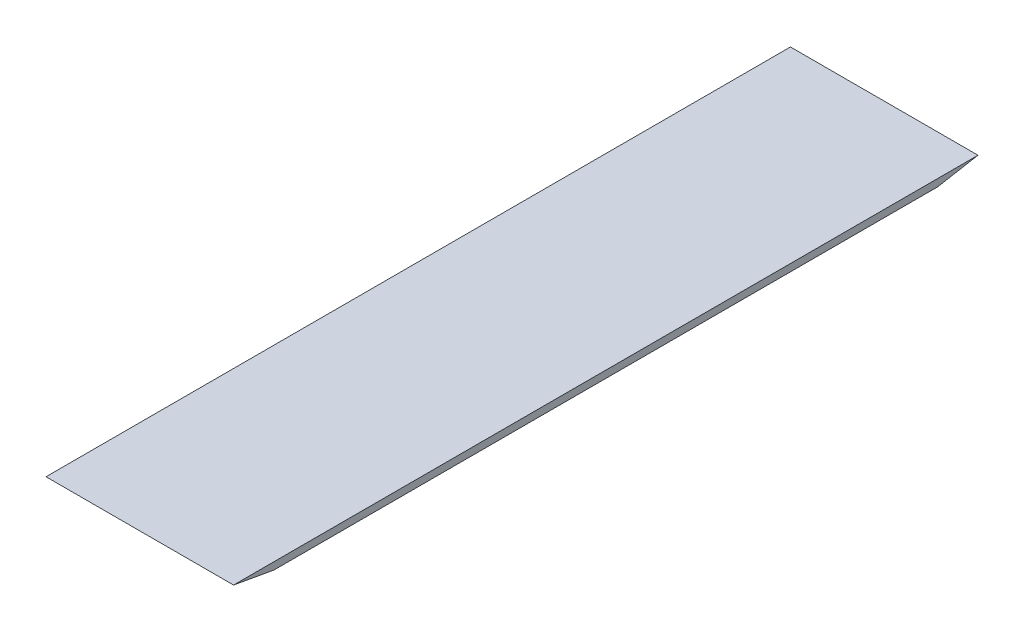
ISO-10303-21;
HEADER;
FILE_DESCRIPTION(('STEP AP214'),'2;1');
FILE_NAME('part.step','',(''),(''),'','','');
FILE_SCHEMA(('AUTOMOTIVE_DESIGN { 1 0 10303 214 1 1 1 1 }'));
ENDSEC;
DATA;
#1=APPLICATION_CONTEXT('core data for automotive mechanical design processes');
#2=APPLICATION_PROTOCOL_DEFINITION('international standard','automotive_design',2000,#1);
#3=PRODUCT_CONTEXT('',#1,'mechanical');
#4=PRODUCT('Part','Part','',(#3));
#5=PRODUCT_RELATED_PRODUCT_CATEGORY('part','',(#4));
#6=PRODUCT_DEFINITION_FORMATION('','',#4);
#7=PRODUCT_DEFINITION_CONTEXT('part definition',#1,'design');
#8=PRODUCT_DEFINITION('design','',#6,#7);
#9=PRODUCT_DEFINITION_SHAPE('','',#8);
#10=(LENGTH_UNIT() NAMED_UNIT(*) SI_UNIT(.MILLI.,.METRE.));
#11=(NAMED_UNIT(*) PLANE_ANGLE_UNIT() SI_UNIT($,.RADIAN.));
#12=(NAMED_UNIT(*) SI_UNIT($,.STERADIAN.) SOLID_ANGLE_UNIT());
#13=UNCERTAINTY_MEASURE_WITH_UNIT(LENGTH_MEASURE(1.E-05),#10,'distance_accuracy_value','');
#14=(GEOMETRIC_REPRESENTATION_CONTEXT(3) GLOBAL_UNCERTAINTY_ASSIGNED_CONTEXT((#13)) GLOBAL_UNIT_ASSIGNED_CONTEXT((#10,
#11,#12)) REPRESENTATION_CONTEXT('',''));
#15=CARTESIAN_POINT('',(0.,0.,0.));
#16=DIRECTION('',(0.,0.,1.));
#17=DIRECTION('',(1.,0.,0.));
#18=AXIS2_PLACEMENT_3D('',#15,#16,#17);
#19=CARTESIAN_POINT('',(130.,0.,0.));
#20=DIRECTION('',(0.,0.984427575508482,-0.175790638483658));
#21=DIRECTION('',(0.,0.175790638483658,0.984427575508482));
#22=AXIS2_PLACEMENT_3D('',#19,#20,#21);
#23=PLANE('',#22);
#24=DIRECTION('',(0.,-0.175790638483658,-0.984427575508482));
#25=VECTOR('',#24,1.);
#26=CARTESIAN_POINT('',(0.,0.,0.));
#27=LINE('',#26,#25);
#28=CARTESIAN_POINT('',(0.,0.,0.));
#29=VERTEX_POINT('',#28);
#30=CARTESIAN_POINT('',(0.,-5.,-28.));
#31=VERTEX_POINT('',#30);
#32=EDGE_CURVE('E107',#29,#31,#27,.T.);
#33=ORIENTED_EDGE('',*,*,#32,.T.);
#34=DIRECTION('',(-1.,0.,0.));
#35=VECTOR('',#34,1.);
#36=CARTESIAN_POINT('',(130.,-5.,-28.));
#37=LINE('',#36,#35);
#38=CARTESIAN_POINT('',(130.,-5.,-28.));
#39=VERTEX_POINT('',#38);
#40=EDGE_CURVE('E11',#39,#31,#37,.T.);
#41=ORIENTED_EDGE('',*,*,#40,.F.);
#42=DIRECTION('',(0.,-0.175790638483658,-0.984427575508482));
#43=VECTOR('',#42,1.);
#44=CARTESIAN_POINT('',(130.,0.,0.));
#45=LINE('',#44,#43);
#46=CARTESIAN_POINT('',(130.,0.,0.));
#47=VERTEX_POINT('',#46);
#48=EDGE_CURVE('E89',#47,#39,#45,.T.);
#49=ORIENTED_EDGE('',*,*,#48,.F.);
#50=DIRECTION('',(-1.,0.,0.));
#51=VECTOR('',#50,1.);
#52=CARTESIAN_POINT('',(130.,0.,0.));
#53=LINE('',#52,#51);
#54=EDGE_CURVE('E56',#47,#29,#53,.T.);
#55=ORIENTED_EDGE('',*,*,#54,.T.);
#56=EDGE_LOOP('',(#33,#41,#49,#55));
#57=FACE_BOUND('',#56,.T.);
#58=ADVANCED_FACE('F39',(#57),#23,.F.);
#59=CARTESIAN_POINT('',(130.,-5.,-28.));
#60=DIRECTION('',(0.,1.,0.));
#61=DIRECTION('',(0.,0.,1.));
#62=AXIS2_PLACEMENT_3D('',#59,#60,#61);
#63=PLANE('',#62);
#64=DIRECTION('',(0.,0.,-1.));
#65=VECTOR('',#64,1.);
#66=CARTESIAN_POINT('',(0.,-5.,-28.));
#67=LINE('',#66,#65);
#68=CARTESIAN_POINT('',(0.,-5.,-488.));
#69=VERTEX_POINT('',#68);
#70=EDGE_CURVE('E95',#31,#69,#67,.T.);
#71=ORIENTED_EDGE('',*,*,#70,.T.);
#72=DIRECTION('',(-1.,0.,0.));
#73=VECTOR('',#72,1.);
#74=CARTESIAN_POINT('',(130.,-5.,-488.));
#75=LINE('',#74,#73);
#76=CARTESIAN_POINT('',(130.,-5.,-488.));
#77=VERTEX_POINT('',#76);
#78=EDGE_CURVE('E48',#77,#69,#75,.T.);
#79=ORIENTED_EDGE('',*,*,#78,.F.);
#80=DIRECTION('',(0.,0.,-1.));
#81=VECTOR('',#80,1.);
#82=CARTESIAN_POINT('',(130.,-5.,-28.));
#83=LINE('',#82,#81);
#84=EDGE_CURVE('E82',#39,#77,#83,.T.);
#85=ORIENTED_EDGE('',*,*,#84,.F.);
#86=ORIENTED_EDGE('',*,*,#40,.T.);
#87=EDGE_LOOP('',(#71,#79,#85,#86));
#88=FACE_BOUND('',#87,.T.);
#89=ADVANCED_FACE('F94',(#88),#63,.F.);
#90=CARTESIAN_POINT('',(130.,-5.,-488.));
#91=DIRECTION('',(0.,0.984427575508482,0.175790638483658));
#92=DIRECTION('',(0.,-0.175790638483658,0.984427575508482));
#93=AXIS2_PLACEMENT_3D('',#90,#91,#92);
#94=PLANE('',#93);
#95=DIRECTION('',(0.,0.175790638483658,-0.984427575508482));
#96=VECTOR('',#95,1.);
#97=CARTESIAN_POINT('',(0.,-5.,-488.));
#98=LINE('',#97,#96);
#99=CARTESIAN_POINT('',(0.,0.,-516.));
#100=VERTEX_POINT('',#99);
#101=EDGE_CURVE('E112',#69,#100,#98,.T.);
#102=ORIENTED_EDGE('',*,*,#101,.T.);
#103=DIRECTION('',(-1.,0.,0.));
#104=VECTOR('',#103,1.);
#105=CARTESIAN_POINT('',(130.,0.,-516.));
#106=LINE('',#105,#104);
#107=CARTESIAN_POINT('',(130.,0.,-516.));
#108=VERTEX_POINT('',#107);
#109=EDGE_CURVE('E71',#108,#100,#106,.T.);
#110=ORIENTED_EDGE('',*,*,#109,.F.);
#111=DIRECTION('',(0.,0.175790638483658,-0.984427575508482));
#112=VECTOR('',#111,1.);
#113=CARTESIAN_POINT('',(130.,-5.,-488.));
#114=LINE('',#113,#112);
#115=EDGE_CURVE('E88',#77,#108,#114,.T.);
#116=ORIENTED_EDGE('',*,*,#115,.F.);
#117=ORIENTED_EDGE('',*,*,#78,.T.);
#118=EDGE_LOOP('',(#102,#110,#116,#117));
#119=FACE_BOUND('',#118,.T.);
#120=ADVANCED_FACE('F99',(#119),#94,.F.);
#121=CARTESIAN_POINT('',(130.,0.,0.));
#122=DIRECTION('',(0.,1.,0.));
#123=DIRECTION('',(0.,0.,1.));
#124=AXIS2_PLACEMENT_3D('',#121,#122,#123);
#125=PLANE('',#124);
#126=DIRECTION('',(0.,0.,-1.));
#127=VECTOR('',#126,1.);
#128=CARTESIAN_POINT('',(0.,0.,0.));
#129=LINE('',#128,#127);
#130=EDGE_CURVE('E115',#29,#100,#129,.T.);
#131=ORIENTED_EDGE('',*,*,#130,.F.);
#132=ORIENTED_EDGE('',*,*,#54,.F.);
#133=DIRECTION('',(0.,0.,-1.));
#134=VECTOR('',#133,1.);
#135=CARTESIAN_POINT('',(130.,0.,0.));
#136=LINE('',#135,#134);
#137=EDGE_CURVE('E101',#47,#108,#136,.T.);
#138=ORIENTED_EDGE('',*,*,#137,.T.);
#139=ORIENTED_EDGE('',*,*,#109,.T.);
#140=EDGE_LOOP('',(#131,#132,#138,#139));
#141=FACE_BOUND('',#140,.T.);
#142=ADVANCED_FACE('F125',(#141),#125,.T.);
#143=CARTESIAN_POINT('',(130.,0.,0.));
#144=DIRECTION('',(1.,0.,0.));
#145=DIRECTION('',(0.,0.,-1.));
#146=AXIS2_PLACEMENT_3D('',#143,#144,#145);
#147=PLANE('',#146);
#148=ORIENTED_EDGE('',*,*,#48,.T.);
#149=ORIENTED_EDGE('',*,*,#84,.T.);
#150=ORIENTED_EDGE('',*,*,#115,.T.);
#151=ORIENTED_EDGE('',*,*,#137,.F.);
#152=EDGE_LOOP('',(#148,#149,#150,#151));
#153=FACE_BOUND('',#152,.T.);
#154=ADVANCED_FACE('F85',(#153),#147,.T.);
#155=CARTESIAN_POINT('',(0.,0.,0.));
#156=DIRECTION('',(1.,0.,0.));
#157=DIRECTION('',(0.,0.,-1.));
#158=AXIS2_PLACEMENT_3D('',#155,#156,#157);
#159=PLANE('',#158);
#160=ORIENTED_EDGE('',*,*,#32,.F.);
#161=ORIENTED_EDGE('',*,*,#130,.T.);
#162=ORIENTED_EDGE('',*,*,#101,.F.);
#163=ORIENTED_EDGE('',*,*,#70,.F.);
#164=EDGE_LOOP('',(#160,#161,#162,#163));
#165=FACE_BOUND('',#164,.T.);
#166=ADVANCED_FACE('F124',(#165),#159,.F.);
#167=CLOSED_SHELL('',(#58,#89,#120,#142,#154,#166));
#168=MANIFOLD_SOLID_BREP('B2',#167);
#169=ADVANCED_BREP_SHAPE_REPRESENTATION('',(#18,#168),#14);
#170=SHAPE_DEFINITION_REPRESENTATION(#9,#169);
ENDSEC;
END-ISO-10303-21;
